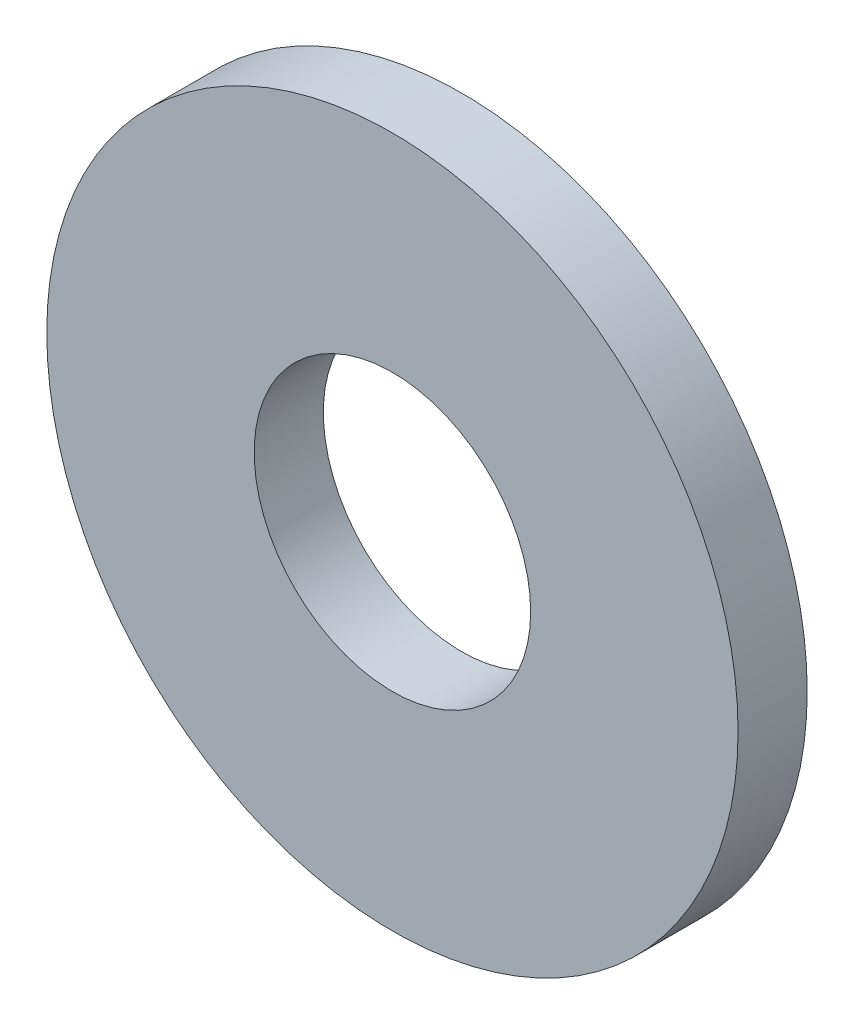
ISO-10303-21;
HEADER;
FILE_DESCRIPTION(('STEP AP214'),'2;1');
FILE_NAME('part.step','',(''),(''),'','','');
FILE_SCHEMA(('AUTOMOTIVE_DESIGN { 1 0 10303 214 1 1 1 1 }'));
ENDSEC;
DATA;
#1=APPLICATION_CONTEXT('core data for automotive mechanical design processes');
#2=APPLICATION_PROTOCOL_DEFINITION('international standard','automotive_design',2000,#1);
#3=PRODUCT_CONTEXT('',#1,'mechanical');
#4=PRODUCT('Part','Part','',(#3));
#5=PRODUCT_RELATED_PRODUCT_CATEGORY('part','',(#4));
#6=PRODUCT_DEFINITION_FORMATION('','',#4);
#7=PRODUCT_DEFINITION_CONTEXT('part definition',#1,'design');
#8=PRODUCT_DEFINITION('design','',#6,#7);
#9=PRODUCT_DEFINITION_SHAPE('','',#8);
#10=(LENGTH_UNIT() NAMED_UNIT(*) SI_UNIT(.MILLI.,.METRE.));
#11=(NAMED_UNIT(*) PLANE_ANGLE_UNIT() SI_UNIT($,.RADIAN.));
#12=(NAMED_UNIT(*) SI_UNIT($,.STERADIAN.) SOLID_ANGLE_UNIT());
#13=UNCERTAINTY_MEASURE_WITH_UNIT(LENGTH_MEASURE(1.E-05),#10,'distance_accuracy_value','');
#14=(GEOMETRIC_REPRESENTATION_CONTEXT(3) GLOBAL_UNCERTAINTY_ASSIGNED_CONTEXT((#13)) GLOBAL_UNIT_ASSIGNED_CONTEXT((#10,
#11,#12)) REPRESENTATION_CONTEXT('',''));
#15=CARTESIAN_POINT('',(0.,0.,0.));
#16=DIRECTION('',(0.,0.,1.));
#17=DIRECTION('',(1.,0.,0.));
#18=AXIS2_PLACEMENT_3D('',#15,#16,#17);
#19=CARTESIAN_POINT('',(0.,0.,1.));
#20=DIRECTION('',(0.,0.,1.));
#21=DIRECTION('',(1.,0.,0.));
#22=AXIS2_PLACEMENT_3D('',#19,#20,#21);
#23=PLANE('',#22);
#24=CARTESIAN_POINT('',(0.,0.,1.));
#25=DIRECTION('',(0.,0.,1.));
#26=DIRECTION('',(1.,0.,0.));
#27=AXIS2_PLACEMENT_3D('',#24,#25,#26);
#28=CIRCLE('',#27,5.);
#29=CARTESIAN_POINT('',(5.,0.,1.));
#30=VERTEX_POINT('',#29);
#31=EDGE_CURVE('E10',#30,#30,#28,.T.);
#32=ORIENTED_EDGE('',*,*,#31,.T.);
#33=EDGE_LOOP('',(#32));
#34=FACE_BOUND('',#33,.T.);
#35=CARTESIAN_POINT('',(0.,0.,1.));
#36=DIRECTION('',(0.,0.,1.));
#37=DIRECTION('',(1.,0.,0.));
#38=AXIS2_PLACEMENT_3D('',#35,#36,#37);
#39=CIRCLE('',#38,2.);
#40=CARTESIAN_POINT('',(2.,0.,1.));
#41=VERTEX_POINT('',#40);
#42=EDGE_CURVE('E41',#41,#41,#39,.T.);
#43=ORIENTED_EDGE('',*,*,#42,.F.);
#44=EDGE_LOOP('',(#43));
#45=FACE_BOUND('',#44,.T.);
#46=ADVANCED_FACE('F30',(#34,#45),#23,.T.);
#47=CARTESIAN_POINT('',(0.,0.,0.));
#48=DIRECTION('',(0.,0.,1.));
#49=DIRECTION('',(1.,0.,0.));
#50=AXIS2_PLACEMENT_3D('',#47,#48,#49);
#51=PLANE('',#50);
#52=CARTESIAN_POINT('',(0.,0.,0.));
#53=DIRECTION('',(0.,0.,1.));
#54=DIRECTION('',(1.,0.,0.));
#55=AXIS2_PLACEMENT_3D('',#52,#53,#54);
#56=CIRCLE('',#55,5.);
#57=CARTESIAN_POINT('',(5.,0.,0.));
#58=VERTEX_POINT('',#57);
#59=EDGE_CURVE('E34',#58,#58,#56,.T.);
#60=ORIENTED_EDGE('',*,*,#59,.F.);
#61=EDGE_LOOP('',(#60));
#62=FACE_BOUND('',#61,.T.);
#63=CARTESIAN_POINT('',(0.,0.,0.));
#64=DIRECTION('',(0.,0.,1.));
#65=DIRECTION('',(1.,0.,0.));
#66=AXIS2_PLACEMENT_3D('',#63,#64,#65);
#67=CIRCLE('',#66,2.);
#68=CARTESIAN_POINT('',(2.,0.,0.));
#69=VERTEX_POINT('',#68);
#70=EDGE_CURVE('E43',#69,#69,#67,.T.);
#71=ORIENTED_EDGE('',*,*,#70,.T.);
#72=EDGE_LOOP('',(#71));
#73=FACE_BOUND('',#72,.T.);
#74=ADVANCED_FACE('F53',(#62,#73),#51,.F.);
#75=CARTESIAN_POINT('',(0.,0.,1.));
#76=DIRECTION('',(0.,0.,-1.));
#77=DIRECTION('',(-1.,0.,0.));
#78=AXIS2_PLACEMENT_3D('',#75,#76,#77);
#79=CYLINDRICAL_SURFACE('',#78,5.);
#80=ORIENTED_EDGE('',*,*,#31,.F.);
#81=EDGE_LOOP('',(#80));
#82=FACE_BOUND('',#81,.T.);
#83=ORIENTED_EDGE('',*,*,#59,.T.);
#84=EDGE_LOOP('',(#83));
#85=FACE_BOUND('',#84,.T.);
#86=ADVANCED_FACE('F32',(#82,#85),#79,.T.);
#87=CARTESIAN_POINT('',(0.,0.,1.));
#88=DIRECTION('',(0.,0.,-1.));
#89=DIRECTION('',(-1.,0.,0.));
#90=AXIS2_PLACEMENT_3D('',#87,#88,#89);
#91=CYLINDRICAL_SURFACE('',#90,2.);
#92=ORIENTED_EDGE('',*,*,#42,.T.);
#93=EDGE_LOOP('',(#92));
#94=FACE_BOUND('',#93,.T.);
#95=ORIENTED_EDGE('',*,*,#70,.F.);
#96=EDGE_LOOP('',(#95));
#97=FACE_BOUND('',#96,.T.);
#98=ADVANCED_FACE('F49',(#94,#97),#91,.F.);
#99=CLOSED_SHELL('',(#46,#74,#86,#98));
#100=MANIFOLD_SOLID_BREP('B2',#99);
#101=ADVANCED_BREP_SHAPE_REPRESENTATION('',(#18,#100),#14);
#102=SHAPE_DEFINITION_REPRESENTATION(#9,#101);
ENDSEC;
END-ISO-10303-21;
